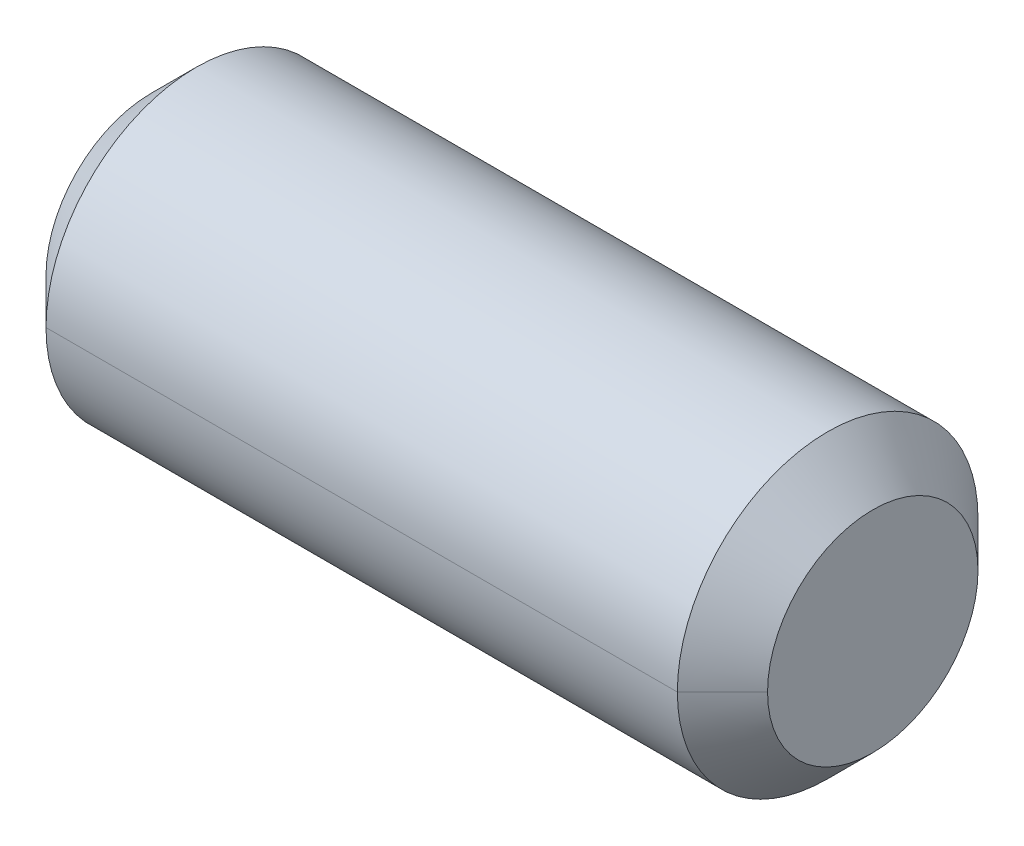
ISO-10303-21;
HEADER;
FILE_DESCRIPTION(('STEP AP214'),'2;1');
FILE_NAME('part.step','',(''),(''),'','','');
FILE_SCHEMA(('AUTOMOTIVE_DESIGN { 1 0 10303 214 1 1 1 1 }'));
ENDSEC;
DATA;
#1=APPLICATION_CONTEXT('core data for automotive mechanical design processes');
#2=APPLICATION_PROTOCOL_DEFINITION('international standard','automotive_design',2000,#1);
#3=PRODUCT_CONTEXT('',#1,'mechanical');
#4=PRODUCT('Part','Part','',(#3));
#5=PRODUCT_RELATED_PRODUCT_CATEGORY('part','',(#4));
#6=PRODUCT_DEFINITION_FORMATION('','',#4);
#7=PRODUCT_DEFINITION_CONTEXT('part definition',#1,'design');
#8=PRODUCT_DEFINITION('design','',#6,#7);
#9=PRODUCT_DEFINITION_SHAPE('','',#8);
#10=(LENGTH_UNIT() NAMED_UNIT(*) SI_UNIT(.MILLI.,.METRE.));
#11=(NAMED_UNIT(*) PLANE_ANGLE_UNIT() SI_UNIT($,.RADIAN.));
#12=(NAMED_UNIT(*) SI_UNIT($,.STERADIAN.) SOLID_ANGLE_UNIT());
#13=UNCERTAINTY_MEASURE_WITH_UNIT(LENGTH_MEASURE(1.E-05),#10,'distance_accuracy_value','');
#14=(GEOMETRIC_REPRESENTATION_CONTEXT(3) GLOBAL_UNCERTAINTY_ASSIGNED_CONTEXT((#13)) GLOBAL_UNIT_ASSIGNED_CONTEXT((#10,
#11,#12)) REPRESENTATION_CONTEXT('',''));
#15=CARTESIAN_POINT('',(0.,0.,0.));
#16=DIRECTION('',(0.,0.,1.));
#17=DIRECTION('',(1.,0.,0.));
#18=AXIS2_PLACEMENT_3D('',#15,#16,#17);
#19=CARTESIAN_POINT('',(6.,0.,0.));
#20=DIRECTION('',(-1.,0.,0.));
#21=DIRECTION('',(0.,0.,1.));
#22=AXIS2_PLACEMENT_3D('',#19,#20,#21);
#23=CONICAL_SURFACE('',#22,1.75,0.785398163397448);
#24=CARTESIAN_POINT('',(6.,0.,0.));
#25=DIRECTION('',(1.,0.,0.));
#26=DIRECTION('',(0.,0.,-1.));
#27=AXIS2_PLACEMENT_3D('',#24,#25,#26);
#28=CIRCLE('',#27,1.75);
#29=CARTESIAN_POINT('',(6.,0.,-1.75));
#30=VERTEX_POINT('',#29);
#31=CARTESIAN_POINT('',(6.,0.,1.75));
#32=VERTEX_POINT('',#31);
#33=EDGE_CURVE('E40',#30,#32,#28,.T.);
#34=ORIENTED_EDGE('',*,*,#33,.F.);
#35=DIRECTION('',(-0.707106781186548,0.,-0.707106781186547));
#36=VECTOR('',#35,1.);
#37=CARTESIAN_POINT('',(6.,0.,-1.75));
#38=LINE('',#37,#36);
#39=CARTESIAN_POINT('',(5.25,0.,-2.5));
#40=VERTEX_POINT('',#39);
#41=EDGE_CURVE('E11',#30,#40,#38,.T.);
#42=ORIENTED_EDGE('',*,*,#41,.T.);
#43=CARTESIAN_POINT('',(5.25,0.,0.));
#44=DIRECTION('',(-1.,0.,0.));
#45=DIRECTION('',(0.,0.,-1.));
#46=AXIS2_PLACEMENT_3D('',#43,#44,#45);
#47=CIRCLE('',#46,2.5);
#48=CARTESIAN_POINT('',(5.25,0.,2.5));
#49=VERTEX_POINT('',#48);
#50=EDGE_CURVE('E129',#49,#40,#47,.T.);
#51=ORIENTED_EDGE('',*,*,#50,.F.);
#52=DIRECTION('',(-0.707106781186548,0.,0.707106781186547));
#53=VECTOR('',#52,1.);
#54=CARTESIAN_POINT('',(6.,0.,1.75));
#55=LINE('',#54,#53);
#56=EDGE_CURVE('E79',#32,#49,#55,.T.);
#57=ORIENTED_EDGE('',*,*,#56,.F.);
#58=EDGE_LOOP('',(#34,#42,#51,#57));
#59=FACE_BOUND('',#58,.T.);
#60=ADVANCED_FACE('F16',(#59),#23,.T.);
#61=CARTESIAN_POINT('',(-5.25,0.,0.));
#62=DIRECTION('',(1.,0.,0.));
#63=DIRECTION('',(0.,0.,-1.));
#64=AXIS2_PLACEMENT_3D('',#61,#62,#63);
#65=CONICAL_SURFACE('',#64,2.5,0.78539816339745);
#66=CARTESIAN_POINT('',(-6.,0.,0.));
#67=DIRECTION('',(-1.,0.,0.));
#68=DIRECTION('',(0.,0.,-1.));
#69=AXIS2_PLACEMENT_3D('',#66,#67,#68);
#70=CIRCLE('',#69,1.75);
#71=CARTESIAN_POINT('',(-6.,0.,1.75));
#72=VERTEX_POINT('',#71);
#73=CARTESIAN_POINT('',(-6.,0.,-1.75));
#74=VERTEX_POINT('',#73);
#75=EDGE_CURVE('E70',#72,#74,#70,.T.);
#76=ORIENTED_EDGE('',*,*,#75,.F.);
#77=DIRECTION('',(0.707106781186546,0.,0.707106781186549));
#78=VECTOR('',#77,1.);
#79=CARTESIAN_POINT('',(-5.25,0.,2.5));
#80=LINE('',#79,#78);
#81=CARTESIAN_POINT('',(-5.25,0.,2.5));
#82=VERTEX_POINT('',#81);
#83=EDGE_CURVE('E26',#72,#82,#80,.T.);
#84=ORIENTED_EDGE('',*,*,#83,.T.);
#85=CARTESIAN_POINT('',(-5.25,0.,0.));
#86=DIRECTION('',(1.,0.,0.));
#87=DIRECTION('',(0.,0.,-1.));
#88=AXIS2_PLACEMENT_3D('',#85,#86,#87);
#89=CIRCLE('',#88,2.5);
#90=CARTESIAN_POINT('',(-5.25,0.,-2.5));
#91=VERTEX_POINT('',#90);
#92=EDGE_CURVE('E73',#91,#82,#89,.T.);
#93=ORIENTED_EDGE('',*,*,#92,.F.);
#94=DIRECTION('',(0.707106781186546,0.,-0.707106781186549));
#95=VECTOR('',#94,1.);
#96=CARTESIAN_POINT('',(-5.25,0.,-2.5));
#97=LINE('',#96,#95);
#98=EDGE_CURVE('E66',#74,#91,#97,.T.);
#99=ORIENTED_EDGE('',*,*,#98,.F.);
#100=EDGE_LOOP('',(#76,#84,#93,#99));
#101=FACE_BOUND('',#100,.T.);
#102=ADVANCED_FACE('F68',(#101),#65,.T.);
#103=CARTESIAN_POINT('',(6.,0.,0.));
#104=DIRECTION('',(-1.,0.,0.));
#105=DIRECTION('',(0.,0.,1.));
#106=AXIS2_PLACEMENT_3D('',#103,#104,#105);
#107=CYLINDRICAL_SURFACE('',#106,2.5);
#108=ORIENTED_EDGE('',*,*,#50,.T.);
#109=DIRECTION('',(-1.,0.,0.));
#110=VECTOR('',#109,1.);
#111=CARTESIAN_POINT('',(6.,0.,-2.5));
#112=LINE('',#111,#110);
#113=EDGE_CURVE('E99',#40,#91,#112,.T.);
#114=ORIENTED_EDGE('',*,*,#113,.T.);
#115=ORIENTED_EDGE('',*,*,#92,.T.);
#116=DIRECTION('',(-1.,0.,0.));
#117=VECTOR('',#116,1.);
#118=CARTESIAN_POINT('',(6.,0.,2.5));
#119=LINE('',#118,#117);
#120=EDGE_CURVE('E103',#49,#82,#119,.T.);
#121=ORIENTED_EDGE('',*,*,#120,.F.);
#122=EDGE_LOOP('',(#108,#114,#115,#121));
#123=FACE_BOUND('',#122,.T.);
#124=ADVANCED_FACE('F127',(#123),#107,.T.);
#125=CARTESIAN_POINT('',(6.,0.,0.));
#126=DIRECTION('',(-1.,0.,0.));
#127=DIRECTION('',(0.,0.,1.));
#128=AXIS2_PLACEMENT_3D('',#125,#126,#127);
#129=CYLINDRICAL_SURFACE('',#128,2.5);
#130=ORIENTED_EDGE('',*,*,#113,.F.);
#131=CARTESIAN_POINT('',(5.25,0.,0.));
#132=DIRECTION('',(-1.,0.,0.));
#133=DIRECTION('',(0.,0.,-1.));
#134=AXIS2_PLACEMENT_3D('',#131,#132,#133);
#135=CIRCLE('',#134,2.5);
#136=EDGE_CURVE('E101',#40,#49,#135,.T.);
#137=ORIENTED_EDGE('',*,*,#136,.T.);
#138=ORIENTED_EDGE('',*,*,#120,.T.);
#139=CARTESIAN_POINT('',(-5.25,0.,0.));
#140=DIRECTION('',(1.,0.,0.));
#141=DIRECTION('',(0.,0.,-1.));
#142=AXIS2_PLACEMENT_3D('',#139,#140,#141);
#143=CIRCLE('',#142,2.5);
#144=EDGE_CURVE('E19',#82,#91,#143,.T.);
#145=ORIENTED_EDGE('',*,*,#144,.T.);
#146=EDGE_LOOP('',(#130,#137,#138,#145));
#147=FACE_BOUND('',#146,.T.);
#148=ADVANCED_FACE('F120',(#147),#129,.T.);
#149=CARTESIAN_POINT('',(6.,0.,0.));
#150=DIRECTION('',(1.,0.,0.));
#151=DIRECTION('',(0.,1.,0.));
#152=AXIS2_PLACEMENT_3D('',#149,#150,#151);
#153=PLANE('',#152);
#154=CARTESIAN_POINT('',(6.,0.,0.));
#155=DIRECTION('',(1.,0.,0.));
#156=DIRECTION('',(0.,0.,-1.));
#157=AXIS2_PLACEMENT_3D('',#154,#155,#156);
#158=CIRCLE('',#157,1.75);
#159=EDGE_CURVE('E95',#32,#30,#158,.T.);
#160=ORIENTED_EDGE('',*,*,#159,.T.);
#161=ORIENTED_EDGE('',*,*,#33,.T.);
#162=EDGE_LOOP('',(#160,#161));
#163=FACE_BOUND('',#162,.T.);
#164=ADVANCED_FACE('F175',(#163),#153,.T.);
#165=CARTESIAN_POINT('',(-6.,0.,0.));
#166=DIRECTION('',(1.,0.,0.));
#167=DIRECTION('',(0.,1.,0.));
#168=AXIS2_PLACEMENT_3D('',#165,#166,#167);
#169=PLANE('',#168);
#170=CARTESIAN_POINT('',(-6.,0.,0.));
#171=DIRECTION('',(-1.,0.,0.));
#172=DIRECTION('',(0.,0.,-1.));
#173=AXIS2_PLACEMENT_3D('',#170,#171,#172);
#174=CIRCLE('',#173,1.75);
#175=EDGE_CURVE('E84',#74,#72,#174,.T.);
#176=ORIENTED_EDGE('',*,*,#175,.T.);
#177=ORIENTED_EDGE('',*,*,#75,.T.);
#178=EDGE_LOOP('',(#176,#177));
#179=FACE_BOUND('',#178,.T.);
#180=ADVANCED_FACE('F83',(#179),#169,.F.);
#181=CARTESIAN_POINT('',(-5.25,0.,0.));
#182=DIRECTION('',(1.,0.,0.));
#183=DIRECTION('',(0.,0.,-1.));
#184=AXIS2_PLACEMENT_3D('',#181,#182,#183);
#185=CONICAL_SURFACE('',#184,2.5,0.78539816339745);
#186=ORIENTED_EDGE('',*,*,#83,.F.);
#187=ORIENTED_EDGE('',*,*,#175,.F.);
#188=ORIENTED_EDGE('',*,*,#98,.T.);
#189=ORIENTED_EDGE('',*,*,#144,.F.);
#190=EDGE_LOOP('',(#186,#187,#188,#189));
#191=FACE_BOUND('',#190,.T.);
#192=ADVANCED_FACE('F87',(#191),#185,.T.);
#193=CARTESIAN_POINT('',(6.,0.,0.));
#194=DIRECTION('',(-1.,0.,0.));
#195=DIRECTION('',(0.,0.,1.));
#196=AXIS2_PLACEMENT_3D('',#193,#194,#195);
#197=CONICAL_SURFACE('',#196,1.75,0.785398163397448);
#198=ORIENTED_EDGE('',*,*,#41,.F.);
#199=ORIENTED_EDGE('',*,*,#159,.F.);
#200=ORIENTED_EDGE('',*,*,#56,.T.);
#201=ORIENTED_EDGE('',*,*,#136,.F.);
#202=EDGE_LOOP('',(#198,#199,#200,#201));
#203=FACE_BOUND('',#202,.T.);
#204=ADVANCED_FACE('F193',(#203),#197,.T.);
#205=CLOSED_SHELL('',(#60,#102,#124,#148,#164,#180,#192,#204));
#206=MANIFOLD_SOLID_BREP('B1',#205);
#207=ADVANCED_BREP_SHAPE_REPRESENTATION('',(#18,#206),#14);
#208=SHAPE_DEFINITION_REPRESENTATION(#9,#207);
ENDSEC;
END-ISO-10303-21;
